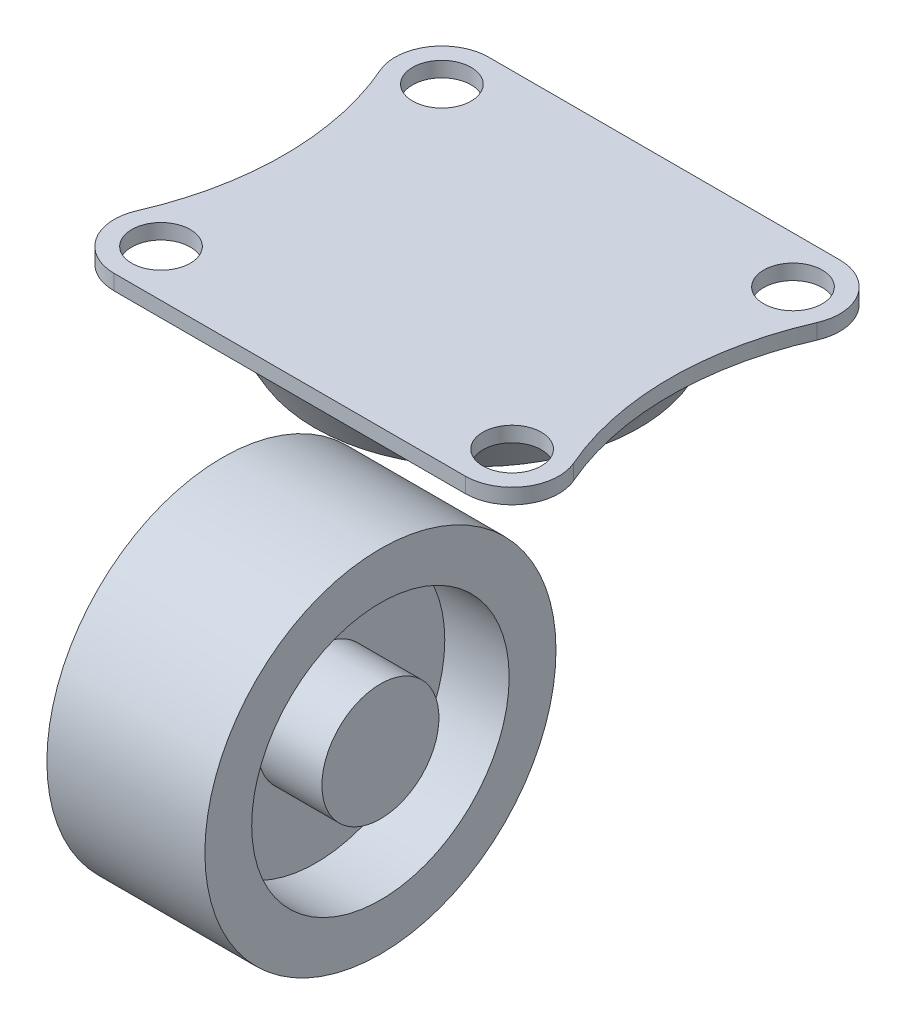
ISO-10303-21;
HEADER;
FILE_DESCRIPTION(('STEP AP214'),'2;1');
FILE_NAME('part.step','',(''),(''),'','','');
FILE_SCHEMA(('AUTOMOTIVE_DESIGN { 1 0 10303 214 1 1 1 1 }'));
ENDSEC;
DATA;
#1=APPLICATION_CONTEXT('core data for automotive mechanical design processes');
#2=APPLICATION_PROTOCOL_DEFINITION('international standard','automotive_design',2000,#1);
#3=PRODUCT_CONTEXT('',#1,'mechanical');
#4=PRODUCT('Part','Part','',(#3));
#5=PRODUCT_RELATED_PRODUCT_CATEGORY('part','',(#4));
#6=PRODUCT_DEFINITION_FORMATION('','',#4);
#7=PRODUCT_DEFINITION_CONTEXT('part definition',#1,'design');
#8=PRODUCT_DEFINITION('design','',#6,#7);
#9=PRODUCT_DEFINITION_SHAPE('','',#8);
#10=(LENGTH_UNIT() NAMED_UNIT(*) SI_UNIT(.MILLI.,.METRE.));
#11=(NAMED_UNIT(*) PLANE_ANGLE_UNIT() SI_UNIT($,.RADIAN.));
#12=(NAMED_UNIT(*) SI_UNIT($,.STERADIAN.) SOLID_ANGLE_UNIT());
#13=UNCERTAINTY_MEASURE_WITH_UNIT(LENGTH_MEASURE(1.E-05),#10,'distance_accuracy_value','');
#14=(GEOMETRIC_REPRESENTATION_CONTEXT(3) GLOBAL_UNCERTAINTY_ASSIGNED_CONTEXT((#13)) GLOBAL_UNIT_ASSIGNED_CONTEXT((#10,
#11,#12)) REPRESENTATION_CONTEXT('',''));
#15=CARTESIAN_POINT('',(0.,0.,0.));
#16=DIRECTION('',(0.,0.,1.));
#17=DIRECTION('',(1.,0.,0.));
#18=AXIS2_PLACEMENT_3D('',#15,#16,#17);
#19=CARTESIAN_POINT('',(-7.63674601971685,-23.7,15.));
#20=DIRECTION('',(-1.,0.,0.));
#21=DIRECTION('',(0.,0.,1.));
#22=AXIS2_PLACEMENT_3D('',#19,#20,#21);
#23=CYLINDRICAL_SURFACE('',#22,15.);
#24=CARTESIAN_POINT('',(6.75,-23.7,15.));
#25=DIRECTION('',(-1.,0.,0.));
#26=DIRECTION('',(0.,0.,1.));
#27=AXIS2_PLACEMENT_3D('',#24,#25,#26);
#28=CIRCLE('',#27,15.);
#29=CARTESIAN_POINT('',(6.74999999999999,-23.7,30.));
#30=VERTEX_POINT('',#29);
#31=EDGE_CURVE('E11',#30,#30,#28,.T.);
#32=ORIENTED_EDGE('',*,*,#31,.T.);
#33=EDGE_LOOP('',(#32));
#34=FACE_BOUND('',#33,.T.);
#35=CARTESIAN_POINT('',(-6.75,-23.7,15.));
#36=DIRECTION('',(-1.,0.,0.));
#37=DIRECTION('',(0.,0.,1.));
#38=AXIS2_PLACEMENT_3D('',#35,#36,#37);
#39=CIRCLE('',#38,15.);
#40=CARTESIAN_POINT('',(-6.75000000000001,-23.7,30.));
#41=VERTEX_POINT('',#40);
#42=EDGE_CURVE('E77',#41,#41,#39,.T.);
#43=ORIENTED_EDGE('',*,*,#42,.F.);
#44=EDGE_LOOP('',(#43));
#45=FACE_BOUND('',#44,.T.);
#46=ADVANCED_FACE('F43',(#34,#45),#23,.T.);
#47=CARTESIAN_POINT('',(6.75,-23.7,0.));
#48=DIRECTION('',(1.,0.,0.));
#49=DIRECTION('',(0.,0.,-1.));
#50=AXIS2_PLACEMENT_3D('',#47,#48,#49);
#51=PLANE('',#50);
#52=CARTESIAN_POINT('',(6.75,-23.7,15.));
#53=DIRECTION('',(-1.,0.,0.));
#54=DIRECTION('',(0.,0.,1.));
#55=AXIS2_PLACEMENT_3D('',#52,#53,#54);
#56=CIRCLE('',#55,11.);
#57=CARTESIAN_POINT('',(6.75,-23.7,26.));
#58=VERTEX_POINT('',#57);
#59=EDGE_CURVE('E49',#58,#58,#56,.T.);
#60=ORIENTED_EDGE('',*,*,#59,.T.);
#61=EDGE_LOOP('',(#60));
#62=FACE_BOUND('',#61,.T.);
#63=ORIENTED_EDGE('',*,*,#31,.F.);
#64=EDGE_LOOP('',(#63));
#65=FACE_BOUND('',#64,.T.);
#66=ADVANCED_FACE('F85',(#62,#65),#51,.T.);
#67=CARTESIAN_POINT('',(-7.63674601971685,-23.7,15.));
#68=DIRECTION('',(-1.,0.,0.));
#69=DIRECTION('',(0.,0.,1.));
#70=AXIS2_PLACEMENT_3D('',#67,#68,#69);
#71=CYLINDRICAL_SURFACE('',#70,11.);
#72=CARTESIAN_POINT('',(1.25,-23.7,15.));
#73=DIRECTION('',(-1.,0.,0.));
#74=DIRECTION('',(0.,0.,1.));
#75=AXIS2_PLACEMENT_3D('',#72,#73,#74);
#76=CIRCLE('',#75,11.);
#77=CARTESIAN_POINT('',(1.25,-23.7,26.));
#78=VERTEX_POINT('',#77);
#79=EDGE_CURVE('E53',#78,#78,#76,.T.);
#80=ORIENTED_EDGE('',*,*,#79,.T.);
#81=EDGE_LOOP('',(#80));
#82=FACE_BOUND('',#81,.T.);
#83=ORIENTED_EDGE('',*,*,#59,.F.);
#84=EDGE_LOOP('',(#83));
#85=FACE_BOUND('',#84,.T.);
#86=ADVANCED_FACE('F89',(#82,#85),#71,.F.);
#87=CARTESIAN_POINT('',(1.25,-23.7,4.));
#88=DIRECTION('',(1.,0.,0.));
#89=DIRECTION('',(0.,0.,-1.));
#90=AXIS2_PLACEMENT_3D('',#87,#88,#89);
#91=PLANE('',#90);
#92=CARTESIAN_POINT('',(1.25,-23.7,15.));
#93=DIRECTION('',(-1.,0.,0.));
#94=DIRECTION('',(0.,0.,1.));
#95=AXIS2_PLACEMENT_3D('',#92,#93,#94);
#96=CIRCLE('',#95,5.00000000000001);
#97=CARTESIAN_POINT('',(1.25,-23.7,20.));
#98=VERTEX_POINT('',#97);
#99=EDGE_CURVE('E57',#98,#98,#96,.T.);
#100=ORIENTED_EDGE('',*,*,#99,.T.);
#101=EDGE_LOOP('',(#100));
#102=FACE_BOUND('',#101,.T.);
#103=ORIENTED_EDGE('',*,*,#79,.F.);
#104=EDGE_LOOP('',(#103));
#105=FACE_BOUND('',#104,.T.);
#106=ADVANCED_FACE('F93',(#102,#105),#91,.T.);
#107=CARTESIAN_POINT('',(-7.63674601971685,-23.7,15.));
#108=DIRECTION('',(-1.,0.,0.));
#109=DIRECTION('',(0.,0.,1.));
#110=AXIS2_PLACEMENT_3D('',#107,#108,#109);
#111=CYLINDRICAL_SURFACE('',#110,5.00000000000001);
#112=CARTESIAN_POINT('',(6.75,-23.7,15.));
#113=DIRECTION('',(-1.,0.,0.));
#114=DIRECTION('',(0.,0.,1.));
#115=AXIS2_PLACEMENT_3D('',#112,#113,#114);
#116=CIRCLE('',#115,5.00000000000001);
#117=CARTESIAN_POINT('',(6.75,-23.7,20.));
#118=VERTEX_POINT('',#117);
#119=EDGE_CURVE('E62',#118,#118,#116,.T.);
#120=ORIENTED_EDGE('',*,*,#119,.T.);
#121=EDGE_LOOP('',(#120));
#122=FACE_BOUND('',#121,.T.);
#123=ORIENTED_EDGE('',*,*,#99,.F.);
#124=EDGE_LOOP('',(#123));
#125=FACE_BOUND('',#124,.T.);
#126=ADVANCED_FACE('F100',(#122,#125),#111,.T.);
#127=CARTESIAN_POINT('',(6.75,-23.7,9.99999999999999));
#128=DIRECTION('',(1.,0.,0.));
#129=DIRECTION('',(0.,0.,-1.));
#130=AXIS2_PLACEMENT_3D('',#127,#128,#129);
#131=PLANE('',#130);
#132=ORIENTED_EDGE('',*,*,#119,.F.);
#133=EDGE_LOOP('',(#132));
#134=FACE_BOUND('',#133,.T.);
#135=ADVANCED_FACE('F104',(#134),#131,.T.);
#136=CARTESIAN_POINT('',(-6.75,-23.7,10.));
#137=DIRECTION('',(-1.,0.,0.));
#138=DIRECTION('',(0.,0.,1.));
#139=AXIS2_PLACEMENT_3D('',#136,#137,#138);
#140=PLANE('',#139);
#141=CARTESIAN_POINT('',(-6.75,-23.7,15.));
#142=DIRECTION('',(-1.,0.,0.));
#143=DIRECTION('',(0.,0.,1.));
#144=AXIS2_PLACEMENT_3D('',#141,#142,#143);
#145=CIRCLE('',#144,5.);
#146=CARTESIAN_POINT('',(-6.75,-23.7,20.));
#147=VERTEX_POINT('',#146);
#148=EDGE_CURVE('E65',#147,#147,#145,.T.);
#149=ORIENTED_EDGE('',*,*,#148,.T.);
#150=EDGE_LOOP('',(#149));
#151=FACE_BOUND('',#150,.T.);
#152=ADVANCED_FACE('F108',(#151),#140,.T.);
#153=CARTESIAN_POINT('',(-7.63674601971685,-23.7,15.));
#154=DIRECTION('',(-1.,0.,0.));
#155=DIRECTION('',(0.,0.,1.));
#156=AXIS2_PLACEMENT_3D('',#153,#154,#155);
#157=CYLINDRICAL_SURFACE('',#156,5.);
#158=CARTESIAN_POINT('',(-1.25,-23.7,15.));
#159=DIRECTION('',(-1.,0.,0.));
#160=DIRECTION('',(0.,0.,1.));
#161=AXIS2_PLACEMENT_3D('',#158,#159,#160);
#162=CIRCLE('',#161,5.);
#163=CARTESIAN_POINT('',(-1.25,-23.7,20.));
#164=VERTEX_POINT('',#163);
#165=EDGE_CURVE('E68',#164,#164,#162,.T.);
#166=ORIENTED_EDGE('',*,*,#165,.T.);
#167=EDGE_LOOP('',(#166));
#168=FACE_BOUND('',#167,.T.);
#169=ORIENTED_EDGE('',*,*,#148,.F.);
#170=EDGE_LOOP('',(#169));
#171=FACE_BOUND('',#170,.T.);
#172=ADVANCED_FACE('F112',(#168,#171),#157,.T.);
#173=CARTESIAN_POINT('',(-1.25,-23.7,4.));
#174=DIRECTION('',(-1.,0.,0.));
#175=DIRECTION('',(0.,0.,1.));
#176=AXIS2_PLACEMENT_3D('',#173,#174,#175);
#177=PLANE('',#176);
#178=CARTESIAN_POINT('',(-1.25,-23.7,15.));
#179=DIRECTION('',(-1.,0.,0.));
#180=DIRECTION('',(0.,0.,1.));
#181=AXIS2_PLACEMENT_3D('',#178,#179,#180);
#182=CIRCLE('',#181,11.);
#183=CARTESIAN_POINT('',(-1.25000000000001,-23.7,26.));
#184=VERTEX_POINT('',#183);
#185=EDGE_CURVE('E71',#184,#184,#182,.T.);
#186=ORIENTED_EDGE('',*,*,#185,.T.);
#187=EDGE_LOOP('',(#186));
#188=FACE_BOUND('',#187,.T.);
#189=ORIENTED_EDGE('',*,*,#165,.F.);
#190=EDGE_LOOP('',(#189));
#191=FACE_BOUND('',#190,.T.);
#192=ADVANCED_FACE('F116',(#188,#191),#177,.T.);
#193=CARTESIAN_POINT('',(-7.63674601971685,-23.7,15.));
#194=DIRECTION('',(-1.,0.,0.));
#195=DIRECTION('',(0.,0.,1.));
#196=AXIS2_PLACEMENT_3D('',#193,#194,#195);
#197=CYLINDRICAL_SURFACE('',#196,11.);
#198=CARTESIAN_POINT('',(-6.75,-23.7,15.));
#199=DIRECTION('',(-1.,0.,0.));
#200=DIRECTION('',(0.,0.,1.));
#201=AXIS2_PLACEMENT_3D('',#198,#199,#200);
#202=CIRCLE('',#201,11.);
#203=CARTESIAN_POINT('',(-6.75000000000001,-23.7,26.));
#204=VERTEX_POINT('',#203);
#205=EDGE_CURVE('E74',#204,#204,#202,.T.);
#206=ORIENTED_EDGE('',*,*,#205,.T.);
#207=EDGE_LOOP('',(#206));
#208=FACE_BOUND('',#207,.T.);
#209=ORIENTED_EDGE('',*,*,#185,.F.);
#210=EDGE_LOOP('',(#209));
#211=FACE_BOUND('',#210,.T.);
#212=ADVANCED_FACE('F120',(#208,#211),#197,.F.);
#213=CARTESIAN_POINT('',(-6.75,-23.7,0.));
#214=DIRECTION('',(-1.,0.,0.));
#215=DIRECTION('',(0.,0.,1.));
#216=AXIS2_PLACEMENT_3D('',#213,#214,#215);
#217=PLANE('',#216);
#218=ORIENTED_EDGE('',*,*,#42,.T.);
#219=EDGE_LOOP('',(#218));
#220=FACE_BOUND('',#219,.T.);
#221=ORIENTED_EDGE('',*,*,#205,.F.);
#222=EDGE_LOOP('',(#221));
#223=FACE_BOUND('',#222,.T.);
#224=ADVANCED_FACE('F81',(#220,#223),#217,.T.);
#225=CLOSED_SHELL('',(#46,#66,#86,#106,#126,#135,#152,#172,#192,#212,#224));
#226=MANIFOLD_SOLID_BREP('B2',#225);
#227=CARTESIAN_POINT('',(-15.,0.,-12.));
#228=DIRECTION('',(0.,1.,0.));
#229=DIRECTION('',(0.,0.,1.));
#230=AXIS2_PLACEMENT_3D('',#227,#228,#229);
#231=PLANE('',#230);
#232=CARTESIAN_POINT('',(0.,0.,0.));
#233=DIRECTION('',(0.,-1.,0.));
#234=DIRECTION('',(0.,0.,-1.));
#235=AXIS2_PLACEMENT_3D('',#232,#233,#234);
#236=CIRCLE('',#235,16.);
#237=CARTESIAN_POINT('',(0.,0.,-16.));
#238=VERTEX_POINT('',#237);
#239=CARTESIAN_POINT('',(0.,0.,16.));
#240=VERTEX_POINT('',#239);
#241=EDGE_CURVE('E214',#238,#240,#236,.T.);
#242=ORIENTED_EDGE('',*,*,#241,.F.);
#243=DIRECTION('',(-1.,0.,0.));
#244=VECTOR('',#243,1.);
#245=CARTESIAN_POINT('',(-15.,0.,-16.));
#246=LINE('',#245,#244);
#247=CARTESIAN_POINT('',(15.,0.,-16.));
#248=VERTEX_POINT('',#247);
#249=EDGE_CURVE('E330',#248,#238,#246,.T.);
#250=ORIENTED_EDGE('',*,*,#249,.F.);
#251=CARTESIAN_POINT('',(15.,0.,-12.));
#252=DIRECTION('',(0.,1.,0.));
#253=DIRECTION('',(0.,0.,1.));
#254=AXIS2_PLACEMENT_3D('',#251,#252,#253);
#255=CIRCLE('',#254,4.);
#256=CARTESIAN_POINT('',(18.6672212978369,0.,-10.4026622296173));
#257=VERTEX_POINT('',#256);
#258=EDGE_CURVE('E328',#257,#248,#255,.T.);
#259=ORIENTED_EDGE('',*,*,#258,.F.);
#260=CARTESIAN_POINT('',(42.55,0.,0.));
#261=DIRECTION('',(0.,-1.,0.));
#262=DIRECTION('',(0.,0.,-1.));
#263=AXIS2_PLACEMENT_3D('',#260,#261,#262);
#264=CIRCLE('',#263,26.05);
#265=CARTESIAN_POINT('',(18.6672212978369,0.,10.4026622296173));
#266=VERTEX_POINT('',#265);
#267=EDGE_CURVE('E300',#266,#257,#264,.T.);
#268=ORIENTED_EDGE('',*,*,#267,.F.);
#269=CARTESIAN_POINT('',(15.,0.,12.));
#270=DIRECTION('',(0.,1.,0.));
#271=DIRECTION('',(0.,0.,1.));
#272=AXIS2_PLACEMENT_3D('',#269,#270,#271);
#273=CIRCLE('',#272,4.);
#274=CARTESIAN_POINT('',(15.,0.,16.));
#275=VERTEX_POINT('',#274);
#276=EDGE_CURVE('E325',#275,#266,#273,.T.);
#277=ORIENTED_EDGE('',*,*,#276,.F.);
#278=DIRECTION('',(1.,0.,0.));
#279=VECTOR('',#278,1.);
#280=CARTESIAN_POINT('',(-15.,0.,16.));
#281=LINE('',#280,#279);
#282=EDGE_CURVE('E321',#240,#275,#281,.T.);
#283=ORIENTED_EDGE('',*,*,#282,.F.);
#284=EDGE_LOOP('',(#242,#250,#259,#268,#277,#283));
#285=FACE_BOUND('',#284,.T.);
#286=CARTESIAN_POINT('',(15.,0.,12.));
#287=DIRECTION('',(0.,1.,0.));
#288=DIRECTION('',(0.,0.,1.));
#289=AXIS2_PLACEMENT_3D('',#286,#287,#288);
#290=CIRCLE('',#289,2.5);
#291=CARTESIAN_POINT('',(15.,0.,14.5));
#292=VERTEX_POINT('',#291);
#293=EDGE_CURVE('E380',#292,#292,#290,.T.);
#294=ORIENTED_EDGE('',*,*,#293,.T.);
#295=EDGE_LOOP('',(#294));
#296=FACE_BOUND('',#295,.T.);
#297=CARTESIAN_POINT('',(15.,0.,-12.));
#298=DIRECTION('',(0.,1.,0.));
#299=DIRECTION('',(0.,0.,-1.));
#300=AXIS2_PLACEMENT_3D('',#297,#298,#299);
#301=CIRCLE('',#300,2.5);
#302=CARTESIAN_POINT('',(15.,0.,-14.5));
#303=VERTEX_POINT('',#302);
#304=EDGE_CURVE('E374',#303,#303,#301,.T.);
#305=ORIENTED_EDGE('',*,*,#304,.T.);
#306=EDGE_LOOP('',(#305));
#307=FACE_BOUND('',#306,.T.);
#308=ADVANCED_FACE('F204',(#285,#296,#307),#231,.F.);
#309=CARTESIAN_POINT('',(-15.,1.3,-12.));
#310=DIRECTION('',(0.,1.,0.));
#311=DIRECTION('',(0.,0.,1.));
#312=AXIS2_PLACEMENT_3D('',#309,#310,#311);
#313=PLANE('',#312);
#314=CARTESIAN_POINT('',(15.,1.3,12.));
#315=DIRECTION('',(0.,1.,0.));
#316=DIRECTION('',(0.,0.,1.));
#317=AXIS2_PLACEMENT_3D('',#314,#315,#316);
#318=CIRCLE('',#317,2.5);
#319=CARTESIAN_POINT('',(15.,1.3,14.5));
#320=VERTEX_POINT('',#319);
#321=EDGE_CURVE('E377',#320,#320,#318,.T.);
#322=ORIENTED_EDGE('',*,*,#321,.F.);
#323=EDGE_LOOP('',(#322));
#324=FACE_BOUND('',#323,.T.);
#325=CARTESIAN_POINT('',(-15.,1.3,-12.));
#326=DIRECTION('',(0.,1.,0.));
#327=DIRECTION('',(0.,0.,1.));
#328=AXIS2_PLACEMENT_3D('',#325,#326,#327);
#329=CIRCLE('',#328,2.5);
#330=CARTESIAN_POINT('',(-15.,1.3,-9.5));
#331=VERTEX_POINT('',#330);
#332=EDGE_CURVE('E317',#331,#331,#329,.T.);
#333=ORIENTED_EDGE('',*,*,#332,.F.);
#334=EDGE_LOOP('',(#333));
#335=FACE_BOUND('',#334,.T.);
#336=CARTESIAN_POINT('',(-15.,1.3,-12.));
#337=DIRECTION('',(0.,1.,0.));
#338=DIRECTION('',(0.,0.,1.));
#339=AXIS2_PLACEMENT_3D('',#336,#337,#338);
#340=CIRCLE('',#339,4.);
#341=CARTESIAN_POINT('',(-15.,1.3,-16.));
#342=VERTEX_POINT('',#341);
#343=CARTESIAN_POINT('',(-18.6672212978369,1.3,-10.4026622296173));
#344=VERTEX_POINT('',#343);
#345=EDGE_CURVE('E332',#342,#344,#340,.T.);
#346=ORIENTED_EDGE('',*,*,#345,.T.);
#347=CARTESIAN_POINT('',(-42.55,1.3,0.));
#348=DIRECTION('',(0.,-1.,0.));
#349=DIRECTION('',(0.,0.,1.));
#350=AXIS2_PLACEMENT_3D('',#347,#348,#349);
#351=CIRCLE('',#350,26.05);
#352=CARTESIAN_POINT('',(-18.6672212978369,1.3,10.4026622296173));
#353=VERTEX_POINT('',#352);
#354=EDGE_CURVE('E269',#344,#353,#351,.T.);
#355=ORIENTED_EDGE('',*,*,#354,.T.);
#356=CARTESIAN_POINT('',(-15.,1.3,12.));
#357=DIRECTION('',(0.,1.,0.));
#358=DIRECTION('',(0.,0.,1.));
#359=AXIS2_PLACEMENT_3D('',#356,#357,#358);
#360=CIRCLE('',#359,4.);
#361=CARTESIAN_POINT('',(-15.,1.3,16.));
#362=VERTEX_POINT('',#361);
#363=EDGE_CURVE('E362',#353,#362,#360,.T.);
#364=ORIENTED_EDGE('',*,*,#363,.T.);
#365=DIRECTION('',(1.,0.,0.));
#366=VECTOR('',#365,1.);
#367=CARTESIAN_POINT('',(-15.,1.3,16.));
#368=LINE('',#367,#366);
#369=CARTESIAN_POINT('',(15.,1.3,16.));
#370=VERTEX_POINT('',#369);
#371=EDGE_CURVE('E361',#362,#370,#368,.T.);
#372=ORIENTED_EDGE('',*,*,#371,.T.);
#373=CARTESIAN_POINT('',(15.,1.3,12.));
#374=DIRECTION('',(0.,1.,0.));
#375=DIRECTION('',(0.,0.,1.));
#376=AXIS2_PLACEMENT_3D('',#373,#374,#375);
#377=CIRCLE('',#376,4.);
#378=CARTESIAN_POINT('',(18.6672212978369,1.3,10.4026622296173));
#379=VERTEX_POINT('',#378);
#380=EDGE_CURVE('E291',#370,#379,#377,.T.);
#381=ORIENTED_EDGE('',*,*,#380,.T.);
#382=CARTESIAN_POINT('',(42.55,1.3,0.));
#383=DIRECTION('',(0.,-1.,0.));
#384=DIRECTION('',(0.,0.,-1.));
#385=AXIS2_PLACEMENT_3D('',#382,#383,#384);
#386=CIRCLE('',#385,26.05);
#387=CARTESIAN_POINT('',(18.6672212978369,1.3,-10.4026622296173));
#388=VERTEX_POINT('',#387);
#389=EDGE_CURVE('E283',#379,#388,#386,.T.);
#390=ORIENTED_EDGE('',*,*,#389,.T.);
#391=CARTESIAN_POINT('',(15.,1.3,-12.));
#392=DIRECTION('',(0.,1.,0.));
#393=DIRECTION('',(0.,0.,1.));
#394=AXIS2_PLACEMENT_3D('',#391,#392,#393);
#395=CIRCLE('',#394,4.);
#396=CARTESIAN_POINT('',(15.,1.3,-16.));
#397=VERTEX_POINT('',#396);
#398=EDGE_CURVE('E288',#388,#397,#395,.T.);
#399=ORIENTED_EDGE('',*,*,#398,.T.);
#400=DIRECTION('',(-1.,0.,0.));
#401=VECTOR('',#400,1.);
#402=CARTESIAN_POINT('',(-15.,1.3,-16.));
#403=LINE('',#402,#401);
#404=EDGE_CURVE('E228',#397,#342,#403,.T.);
#405=ORIENTED_EDGE('',*,*,#404,.T.);
#406=EDGE_LOOP('',(#346,#355,#364,#372,#381,#390,#399,#405));
#407=FACE_BOUND('',#406,.T.);
#408=CARTESIAN_POINT('',(15.,1.3,-12.));
#409=DIRECTION('',(0.,1.,0.));
#410=DIRECTION('',(0.,0.,-1.));
#411=AXIS2_PLACEMENT_3D('',#408,#409,#410);
#412=CIRCLE('',#411,2.5);
#413=CARTESIAN_POINT('',(15.,1.3,-14.5));
#414=VERTEX_POINT('',#413);
#415=EDGE_CURVE('E371',#414,#414,#412,.T.);
#416=ORIENTED_EDGE('',*,*,#415,.F.);
#417=EDGE_LOOP('',(#416));
#418=FACE_BOUND('',#417,.T.);
#419=CARTESIAN_POINT('',(-15.,1.3,12.));
#420=DIRECTION('',(0.,1.,0.));
#421=DIRECTION('',(0.,0.,-1.));
#422=AXIS2_PLACEMENT_3D('',#419,#420,#421);
#423=CIRCLE('',#422,2.5);
#424=CARTESIAN_POINT('',(-15.,1.3,9.50000000000001));
#425=VERTEX_POINT('',#424);
#426=EDGE_CURVE('E383',#425,#425,#423,.T.);
#427=ORIENTED_EDGE('',*,*,#426,.F.);
#428=EDGE_LOOP('',(#427));
#429=FACE_BOUND('',#428,.T.);
#430=ADVANCED_FACE('F285',(#324,#335,#407,#418,#429),#313,.T.);
#431=EDGE_CURVE('E41',#240,#238,#236,.T.);
#432=ORIENTED_EDGE('',*,*,#431,.F.);
#433=CARTESIAN_POINT('',(-15.,0.,16.));
#434=VERTEX_POINT('',#433);
#435=EDGE_CURVE('E322',#434,#240,#281,.T.);
#436=ORIENTED_EDGE('',*,*,#435,.F.);
#437=CARTESIAN_POINT('',(-15.,0.,12.));
#438=DIRECTION('',(0.,1.,0.));
#439=DIRECTION('',(0.,0.,1.));
#440=AXIS2_PLACEMENT_3D('',#437,#438,#439);
#441=CIRCLE('',#440,4.);
#442=CARTESIAN_POINT('',(-18.6672212978369,0.,10.4026622296173));
#443=VERTEX_POINT('',#442);
#444=EDGE_CURVE('E319',#443,#434,#441,.T.);
#445=ORIENTED_EDGE('',*,*,#444,.F.);
#446=CARTESIAN_POINT('',(-42.55,0.,0.));
#447=DIRECTION('',(0.,-1.,0.));
#448=DIRECTION('',(0.,0.,1.));
#449=AXIS2_PLACEMENT_3D('',#446,#447,#448);
#450=CIRCLE('',#449,26.05);
#451=CARTESIAN_POINT('',(-18.6672212978369,0.,-10.4026622296173));
#452=VERTEX_POINT('',#451);
#453=EDGE_CURVE('E316',#452,#443,#450,.T.);
#454=ORIENTED_EDGE('',*,*,#453,.F.);
#455=CARTESIAN_POINT('',(-15.,0.,-12.));
#456=DIRECTION('',(0.,1.,0.));
#457=DIRECTION('',(0.,0.,1.));
#458=AXIS2_PLACEMENT_3D('',#455,#456,#457);
#459=CIRCLE('',#458,4.);
#460=CARTESIAN_POINT('',(-15.,0.,-16.));
#461=VERTEX_POINT('',#460);
#462=EDGE_CURVE('E313',#461,#452,#459,.T.);
#463=ORIENTED_EDGE('',*,*,#462,.F.);
#464=EDGE_CURVE('E260',#238,#461,#246,.T.);
#465=ORIENTED_EDGE('',*,*,#464,.F.);
#466=EDGE_LOOP('',(#432,#436,#445,#454,#463,#465));
#467=FACE_BOUND('',#466,.T.);
#468=CARTESIAN_POINT('',(-15.,0.,-12.));
#469=DIRECTION('',(0.,1.,0.));
#470=DIRECTION('',(0.,0.,1.));
#471=AXIS2_PLACEMENT_3D('',#468,#469,#470);
#472=CIRCLE('',#471,2.5);
#473=CARTESIAN_POINT('',(-15.,0.,-9.5));
#474=VERTEX_POINT('',#473);
#475=EDGE_CURVE('E368',#474,#474,#472,.T.);
#476=ORIENTED_EDGE('',*,*,#475,.T.);
#477=EDGE_LOOP('',(#476));
#478=FACE_BOUND('',#477,.T.);
#479=CARTESIAN_POINT('',(-15.,0.,12.));
#480=DIRECTION('',(0.,1.,0.));
#481=DIRECTION('',(0.,0.,-1.));
#482=AXIS2_PLACEMENT_3D('',#479,#480,#481);
#483=CIRCLE('',#482,2.5);
#484=CARTESIAN_POINT('',(-15.,0.,9.50000000000001));
#485=VERTEX_POINT('',#484);
#486=EDGE_CURVE('E386',#485,#485,#483,.T.);
#487=ORIENTED_EDGE('',*,*,#486,.T.);
#488=EDGE_LOOP('',(#487));
#489=FACE_BOUND('',#488,.T.);
#490=ADVANCED_FACE('F351',(#467,#478,#489),#231,.F.);
#491=CARTESIAN_POINT('',(-15.,1.3,-12.));
#492=DIRECTION('',(0.,-1.,0.));
#493=DIRECTION('',(0.,0.,-1.));
#494=AXIS2_PLACEMENT_3D('',#491,#492,#493);
#495=CYLINDRICAL_SURFACE('',#494,4.);
#496=ORIENTED_EDGE('',*,*,#462,.T.);
#497=DIRECTION('',(0.,-1.,0.));
#498=VECTOR('',#497,1.);
#499=CARTESIAN_POINT('',(-18.6672212978369,1.3,-10.4026622296173));
#500=LINE('',#499,#498);
#501=EDGE_CURVE('E208',#344,#452,#500,.T.);
#502=ORIENTED_EDGE('',*,*,#501,.F.);
#503=ORIENTED_EDGE('',*,*,#345,.F.);
#504=DIRECTION('',(0.,-1.,0.));
#505=VECTOR('',#504,1.);
#506=CARTESIAN_POINT('',(-15.,1.3,-16.));
#507=LINE('',#506,#505);
#508=EDGE_CURVE('E309',#342,#461,#507,.T.);
#509=ORIENTED_EDGE('',*,*,#508,.T.);
#510=EDGE_LOOP('',(#496,#502,#503,#509));
#511=FACE_BOUND('',#510,.T.);
#512=ADVANCED_FACE('F206',(#511),#495,.T.);
#513=CARTESIAN_POINT('',(-42.55,1.3,0.));
#514=DIRECTION('',(0.,-1.,0.));
#515=DIRECTION('',(0.,0.,-1.));
#516=AXIS2_PLACEMENT_3D('',#513,#514,#515);
#517=CYLINDRICAL_SURFACE('',#516,26.05);
#518=ORIENTED_EDGE('',*,*,#453,.T.);
#519=DIRECTION('',(0.,-1.,0.));
#520=VECTOR('',#519,1.);
#521=CARTESIAN_POINT('',(-18.6672212978369,1.3,10.4026622296173));
#522=LINE('',#521,#520);
#523=EDGE_CURVE('E341',#353,#443,#522,.T.);
#524=ORIENTED_EDGE('',*,*,#523,.F.);
#525=ORIENTED_EDGE('',*,*,#354,.F.);
#526=ORIENTED_EDGE('',*,*,#501,.T.);
#527=EDGE_LOOP('',(#518,#524,#525,#526));
#528=FACE_BOUND('',#527,.T.);
#529=ADVANCED_FACE('F347',(#528),#517,.F.);
#530=CARTESIAN_POINT('',(-15.,1.3,12.));
#531=DIRECTION('',(0.,-1.,0.));
#532=DIRECTION('',(0.,0.,-1.));
#533=AXIS2_PLACEMENT_3D('',#530,#531,#532);
#534=CYLINDRICAL_SURFACE('',#533,4.);
#535=ORIENTED_EDGE('',*,*,#444,.T.);
#536=DIRECTION('',(0.,-1.,0.));
#537=VECTOR('',#536,1.);
#538=CARTESIAN_POINT('',(-15.,1.3,16.));
#539=LINE('',#538,#537);
#540=EDGE_CURVE('E339',#362,#434,#539,.T.);
#541=ORIENTED_EDGE('',*,*,#540,.F.);
#542=ORIENTED_EDGE('',*,*,#363,.F.);
#543=ORIENTED_EDGE('',*,*,#523,.T.);
#544=EDGE_LOOP('',(#535,#541,#542,#543));
#545=FACE_BOUND('',#544,.T.);
#546=ADVANCED_FACE('F355',(#545),#534,.T.);
#547=CARTESIAN_POINT('',(-15.,1.3,16.));
#548=DIRECTION('',(0.,0.,-1.));
#549=DIRECTION('',(-1.,0.,0.));
#550=AXIS2_PLACEMENT_3D('',#547,#548,#549);
#551=PLANE('',#550);
#552=ORIENTED_EDGE('',*,*,#435,.T.);
#553=ORIENTED_EDGE('',*,*,#282,.T.);
#554=DIRECTION('',(0.,-1.,0.));
#555=VECTOR('',#554,1.);
#556=CARTESIAN_POINT('',(15.,1.3,16.));
#557=LINE('',#556,#555);
#558=EDGE_CURVE('E336',#370,#275,#557,.T.);
#559=ORIENTED_EDGE('',*,*,#558,.F.);
#560=ORIENTED_EDGE('',*,*,#371,.F.);
#561=ORIENTED_EDGE('',*,*,#540,.T.);
#562=EDGE_LOOP('',(#552,#553,#559,#560,#561));
#563=FACE_BOUND('',#562,.T.);
#564=ADVANCED_FACE('F358',(#563),#551,.F.);
#565=CARTESIAN_POINT('',(15.,1.3,12.));
#566=DIRECTION('',(0.,-1.,0.));
#567=DIRECTION('',(0.,0.,-1.));
#568=AXIS2_PLACEMENT_3D('',#565,#566,#567);
#569=CYLINDRICAL_SURFACE('',#568,4.);
#570=ORIENTED_EDGE('',*,*,#276,.T.);
#571=DIRECTION('',(0.,-1.,0.));
#572=VECTOR('',#571,1.);
#573=CARTESIAN_POINT('',(18.6672212978369,1.3,10.4026622296173));
#574=LINE('',#573,#572);
#575=EDGE_CURVE('E303',#379,#266,#574,.T.);
#576=ORIENTED_EDGE('',*,*,#575,.F.);
#577=ORIENTED_EDGE('',*,*,#380,.F.);
#578=ORIENTED_EDGE('',*,*,#558,.T.);
#579=EDGE_LOOP('',(#570,#576,#577,#578));
#580=FACE_BOUND('',#579,.T.);
#581=ADVANCED_FACE('F432',(#580),#569,.T.);
#582=CARTESIAN_POINT('',(42.55,1.3,0.));
#583=DIRECTION('',(0.,-1.,0.));
#584=DIRECTION('',(0.,0.,-1.));
#585=AXIS2_PLACEMENT_3D('',#582,#583,#584);
#586=CYLINDRICAL_SURFACE('',#585,26.05);
#587=ORIENTED_EDGE('',*,*,#267,.T.);
#588=DIRECTION('',(0.,-1.,0.));
#589=VECTOR('',#588,1.);
#590=CARTESIAN_POINT('',(18.6672212978369,1.3,-10.4026622296173));
#591=LINE('',#590,#589);
#592=EDGE_CURVE('E297',#388,#257,#591,.T.);
#593=ORIENTED_EDGE('',*,*,#592,.F.);
#594=ORIENTED_EDGE('',*,*,#389,.F.);
#595=ORIENTED_EDGE('',*,*,#575,.T.);
#596=EDGE_LOOP('',(#587,#593,#594,#595));
#597=FACE_BOUND('',#596,.T.);
#598=ADVANCED_FACE('F298',(#597),#586,.F.);
#599=CARTESIAN_POINT('',(15.,1.3,-12.));
#600=DIRECTION('',(0.,-1.,0.));
#601=DIRECTION('',(0.,0.,-1.));
#602=AXIS2_PLACEMENT_3D('',#599,#600,#601);
#603=CYLINDRICAL_SURFACE('',#602,4.);
#604=ORIENTED_EDGE('',*,*,#258,.T.);
#605=DIRECTION('',(0.,-1.,0.));
#606=VECTOR('',#605,1.);
#607=CARTESIAN_POINT('',(15.,1.3,-16.));
#608=LINE('',#607,#606);
#609=EDGE_CURVE('E304',#397,#248,#608,.T.);
#610=ORIENTED_EDGE('',*,*,#609,.F.);
#611=ORIENTED_EDGE('',*,*,#398,.F.);
#612=ORIENTED_EDGE('',*,*,#592,.T.);
#613=EDGE_LOOP('',(#604,#610,#611,#612));
#614=FACE_BOUND('',#613,.T.);
#615=ADVANCED_FACE('F306',(#614),#603,.T.);
#616=CARTESIAN_POINT('',(-15.,1.3,-16.));
#617=DIRECTION('',(0.,0.,1.));
#618=DIRECTION('',(1.,0.,0.));
#619=AXIS2_PLACEMENT_3D('',#616,#617,#618);
#620=PLANE('',#619);
#621=ORIENTED_EDGE('',*,*,#249,.T.);
#622=ORIENTED_EDGE('',*,*,#464,.T.);
#623=ORIENTED_EDGE('',*,*,#508,.F.);
#624=ORIENTED_EDGE('',*,*,#404,.F.);
#625=ORIENTED_EDGE('',*,*,#609,.T.);
#626=EDGE_LOOP('',(#621,#622,#623,#624,#625));
#627=FACE_BOUND('',#626,.T.);
#628=ADVANCED_FACE('F399',(#627),#620,.F.);
#629=CARTESIAN_POINT('',(-15.,1.3,-12.));
#630=DIRECTION('',(0.,-1.,0.));
#631=DIRECTION('',(0.,0.,-1.));
#632=AXIS2_PLACEMENT_3D('',#629,#630,#631);
#633=CYLINDRICAL_SURFACE('',#632,2.5);
#634=ORIENTED_EDGE('',*,*,#332,.T.);
#635=EDGE_LOOP('',(#634));
#636=FACE_BOUND('',#635,.T.);
#637=ORIENTED_EDGE('',*,*,#475,.F.);
#638=EDGE_LOOP('',(#637));
#639=FACE_BOUND('',#638,.T.);
#640=ADVANCED_FACE('F401',(#636,#639),#633,.F.);
#641=CARTESIAN_POINT('',(15.,1.3,-12.));
#642=DIRECTION('',(0.,-1.,0.));
#643=DIRECTION('',(0.,0.,-1.));
#644=AXIS2_PLACEMENT_3D('',#641,#642,#643);
#645=CYLINDRICAL_SURFACE('',#644,2.5);
#646=ORIENTED_EDGE('',*,*,#415,.T.);
#647=EDGE_LOOP('',(#646));
#648=FACE_BOUND('',#647,.T.);
#649=ORIENTED_EDGE('',*,*,#304,.F.);
#650=EDGE_LOOP('',(#649));
#651=FACE_BOUND('',#650,.T.);
#652=ADVANCED_FACE('F407',(#648,#651),#645,.F.);
#653=CARTESIAN_POINT('',(15.,1.3,12.));
#654=DIRECTION('',(0.,-1.,0.));
#655=DIRECTION('',(0.,0.,-1.));
#656=AXIS2_PLACEMENT_3D('',#653,#654,#655);
#657=CYLINDRICAL_SURFACE('',#656,2.5);
#658=ORIENTED_EDGE('',*,*,#321,.T.);
#659=EDGE_LOOP('',(#658));
#660=FACE_BOUND('',#659,.T.);
#661=ORIENTED_EDGE('',*,*,#293,.F.);
#662=EDGE_LOOP('',(#661));
#663=FACE_BOUND('',#662,.T.);
#664=ADVANCED_FACE('F461',(#660,#663),#657,.F.);
#665=CARTESIAN_POINT('',(-15.,1.3,12.));
#666=DIRECTION('',(0.,-1.,0.));
#667=DIRECTION('',(0.,0.,-1.));
#668=AXIS2_PLACEMENT_3D('',#665,#666,#667);
#669=CYLINDRICAL_SURFACE('',#668,2.5);
#670=ORIENTED_EDGE('',*,*,#426,.T.);
#671=EDGE_LOOP('',(#670));
#672=FACE_BOUND('',#671,.T.);
#673=ORIENTED_EDGE('',*,*,#486,.F.);
#674=EDGE_LOOP('',(#673));
#675=FACE_BOUND('',#674,.T.);
#676=ADVANCED_FACE('F471',(#672,#675),#669,.F.);
#677=CARTESIAN_POINT('',(0.,0.,0.));
#678=DIRECTION('',(0.,1.,0.));
#679=DIRECTION('',(0.,0.,-1.));
#680=AXIS2_PLACEMENT_3D('',#677,#678,#679);
#681=CONICAL_SURFACE('',#680,16.,0.5235987755983);
#682=CARTESIAN_POINT('',(0.,-3.7,0.));
#683=DIRECTION('',(0.,-1.,0.));
#684=DIRECTION('',(0.,0.,-1.));
#685=AXIS2_PLACEMENT_3D('',#682,#683,#684);
#686=CIRCLE('',#685,13.8638040039984);
#687=CARTESIAN_POINT('',(0.,-3.7,-13.8638040039984));
#688=VERTEX_POINT('',#687);
#689=EDGE_CURVE('E389',#688,#688,#686,.T.);
#690=ORIENTED_EDGE('',*,*,#689,.F.);
#691=EDGE_LOOP('',(#690));
#692=FACE_BOUND('',#691,.T.);
#693=ORIENTED_EDGE('',*,*,#241,.T.);
#694=ORIENTED_EDGE('',*,*,#431,.T.);
#695=EDGE_LOOP('',(#693,#694));
#696=FACE_BOUND('',#695,.T.);
#697=ADVANCED_FACE('F394',(#692,#696),#681,.T.);
#698=CARTESIAN_POINT('',(0.,-3.7,0.));
#699=DIRECTION('',(0.,-1.,0.));
#700=DIRECTION('',(0.,0.,-1.));
#701=AXIS2_PLACEMENT_3D('',#698,#699,#700);
#702=PLANE('',#701);
#703=ORIENTED_EDGE('',*,*,#689,.T.);
#704=EDGE_LOOP('',(#703));
#705=FACE_BOUND('',#704,.T.);
#706=ADVANCED_FACE('F511',(#705),#702,.T.);
#707=CLOSED_SHELL('',(#308,#430,#490,#512,#529,#546,#564,#581,#598,#615,#628,#640,#652,#664,
#676,#697,#706));
#708=MANIFOLD_SOLID_BREP('B6',#707);
#709=ADVANCED_BREP_SHAPE_REPRESENTATION('',(#18,#226,#708),#14);
#710=SHAPE_DEFINITION_REPRESENTATION(#9,#709);
ENDSEC;
END-ISO-10303-21;
